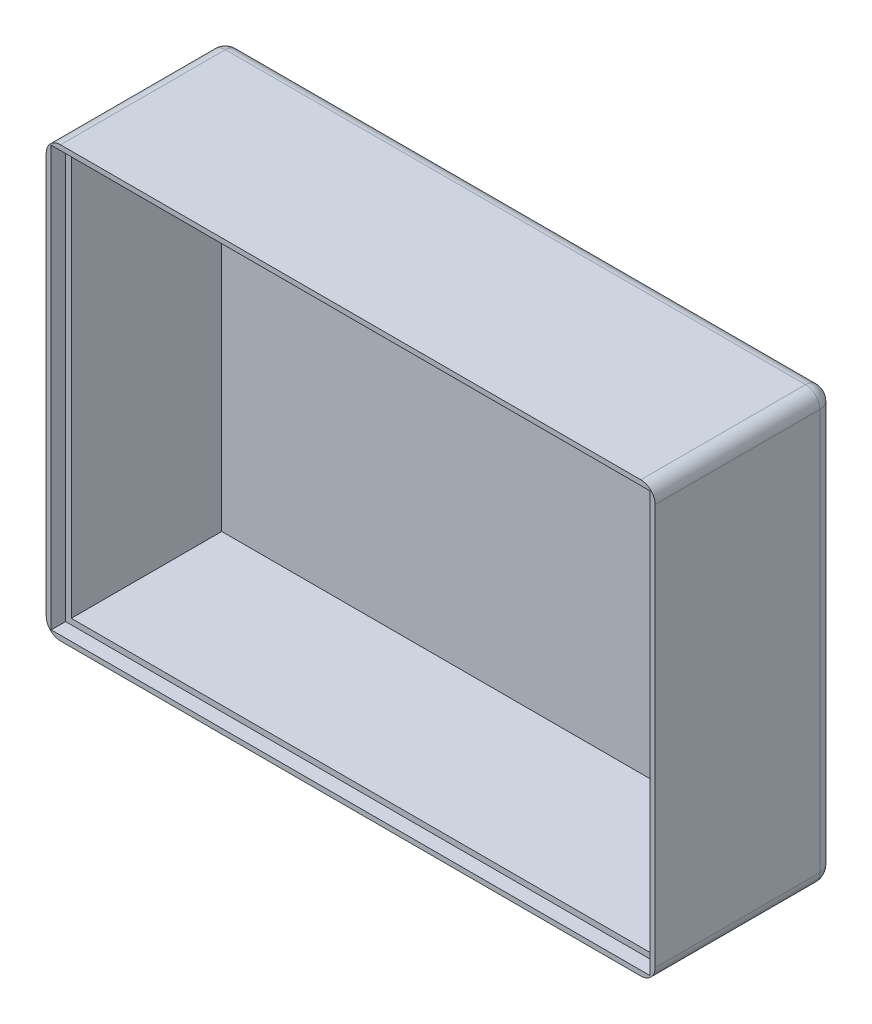
ISO-10303-21;
HEADER;
FILE_DESCRIPTION(('STEP AP214'),'2;1');
FILE_NAME('part.step','',(''),(''),'','','');
FILE_SCHEMA(('AUTOMOTIVE_DESIGN { 1 0 10303 214 1 1 1 1 }'));
ENDSEC;
DATA;
#1=APPLICATION_CONTEXT('core data for automotive mechanical design processes');
#2=APPLICATION_PROTOCOL_DEFINITION('international standard','automotive_design',2000,#1);
#3=PRODUCT_CONTEXT('',#1,'mechanical');
#4=PRODUCT('Part','Part','',(#3));
#5=PRODUCT_RELATED_PRODUCT_CATEGORY('part','',(#4));
#6=PRODUCT_DEFINITION_FORMATION('','',#4);
#7=PRODUCT_DEFINITION_CONTEXT('part definition',#1,'design');
#8=PRODUCT_DEFINITION('design','',#6,#7);
#9=PRODUCT_DEFINITION_SHAPE('','',#8);
#10=(LENGTH_UNIT() NAMED_UNIT(*) SI_UNIT(.MILLI.,.METRE.));
#11=(NAMED_UNIT(*) PLANE_ANGLE_UNIT() SI_UNIT($,.RADIAN.));
#12=(NAMED_UNIT(*) SI_UNIT($,.STERADIAN.) SOLID_ANGLE_UNIT());
#13=UNCERTAINTY_MEASURE_WITH_UNIT(LENGTH_MEASURE(1.E-05),#10,'distance_accuracy_value','');
#14=(GEOMETRIC_REPRESENTATION_CONTEXT(3) GLOBAL_UNCERTAINTY_ASSIGNED_CONTEXT((#13)) GLOBAL_UNIT_ASSIGNED_CONTEXT((#10,
#11,#12)) REPRESENTATION_CONTEXT('',''));
#15=CARTESIAN_POINT('',(0.,0.,0.));
#16=DIRECTION('',(0.,0.,1.));
#17=DIRECTION('',(1.,0.,0.));
#18=AXIS2_PLACEMENT_3D('',#15,#16,#17);
#19=CARTESIAN_POINT('',(0.,0.,25.));
#20=DIRECTION('',(0.,1.,0.));
#21=DIRECTION('',(0.,0.,1.));
#22=AXIS2_PLACEMENT_3D('',#19,#20,#21);
#23=PLANE('',#22);
#24=DIRECTION('',(1.,0.,0.));
#25=VECTOR('',#24,1.);
#26=CARTESIAN_POINT('',(0.,0.,2.));
#27=LINE('',#26,#25);
#28=CARTESIAN_POINT('',(83.,0.,2.));
#29=VERTEX_POINT('',#28);
#30=CARTESIAN_POINT('',(2.,0.,2.));
#31=VERTEX_POINT('',#30);
#32=EDGE_CURVE('E54',#29,#31,#27,.F.);
#33=ORIENTED_EDGE('',*,*,#32,.T.);
#34=DIRECTION('',(0.,0.,-1.));
#35=VECTOR('',#34,1.);
#36=CARTESIAN_POINT('',(2.,0.,25.));
#37=LINE('',#36,#35);
#38=CARTESIAN_POINT('',(2.,0.,25.));
#39=VERTEX_POINT('',#38);
#40=EDGE_CURVE('E11',#31,#39,#37,.F.);
#41=ORIENTED_EDGE('',*,*,#40,.T.);
#42=DIRECTION('',(1.,0.,0.));
#43=VECTOR('',#42,1.);
#44=CARTESIAN_POINT('',(0.,0.,25.));
#45=LINE('',#44,#43);
#46=CARTESIAN_POINT('',(83.,0.,25.));
#47=VERTEX_POINT('',#46);
#48=EDGE_CURVE('E254',#39,#47,#45,.T.);
#49=ORIENTED_EDGE('',*,*,#48,.T.);
#50=DIRECTION('',(0.,0.,-1.));
#51=VECTOR('',#50,1.);
#52=CARTESIAN_POINT('',(83.,0.,25.));
#53=LINE('',#52,#51);
#54=EDGE_CURVE('E68',#47,#29,#53,.T.);
#55=ORIENTED_EDGE('',*,*,#54,.T.);
#56=EDGE_LOOP('',(#33,#41,#49,#55));
#57=FACE_BOUND('',#56,.T.);
#58=ADVANCED_FACE('F44',(#57),#23,.T.);
#59=CARTESIAN_POINT('',(0.,0.,25.));
#60=DIRECTION('',(1.,0.,0.));
#61=DIRECTION('',(0.,1.,0.));
#62=AXIS2_PLACEMENT_3D('',#59,#60,#61);
#63=PLANE('',#62);
#64=DIRECTION('',(0.,-1.,0.));
#65=VECTOR('',#64,1.);
#66=CARTESIAN_POINT('',(0.,-60.,2.));
#67=LINE('',#66,#65);
#68=CARTESIAN_POINT('',(0.,-2.,2.));
#69=VERTEX_POINT('',#68);
#70=CARTESIAN_POINT('',(0.,-58.,2.));
#71=VERTEX_POINT('',#70);
#72=EDGE_CURVE('E332',#69,#71,#67,.T.);
#73=ORIENTED_EDGE('',*,*,#72,.T.);
#74=DIRECTION('',(0.,0.,-1.));
#75=VECTOR('',#74,1.);
#76=CARTESIAN_POINT('',(0.,-58.,25.));
#77=LINE('',#76,#75);
#78=CARTESIAN_POINT('',(0.,-58.,25.));
#79=VERTEX_POINT('',#78);
#80=EDGE_CURVE('E331',#71,#79,#77,.F.);
#81=ORIENTED_EDGE('',*,*,#80,.T.);
#82=DIRECTION('',(0.,-1.,0.));
#83=VECTOR('',#82,1.);
#84=CARTESIAN_POINT('',(0.,0.,25.));
#85=LINE('',#84,#83);
#86=CARTESIAN_POINT('',(0.,-2.,25.));
#87=VERTEX_POINT('',#86);
#88=EDGE_CURVE('E280',#87,#79,#85,.T.);
#89=ORIENTED_EDGE('',*,*,#88,.F.);
#90=DIRECTION('',(0.,0.,-1.));
#91=VECTOR('',#90,1.);
#92=CARTESIAN_POINT('',(0.,-2.,0.));
#93=LINE('',#92,#91);
#94=EDGE_CURVE('E327',#87,#69,#93,.T.);
#95=ORIENTED_EDGE('',*,*,#94,.T.);
#96=EDGE_LOOP('',(#73,#81,#89,#95));
#97=FACE_BOUND('',#96,.T.);
#98=ADVANCED_FACE('F399',(#97),#63,.F.);
#99=CARTESIAN_POINT('',(0.,-60.,25.));
#100=DIRECTION('',(0.,1.,0.));
#101=DIRECTION('',(0.,0.,1.));
#102=AXIS2_PLACEMENT_3D('',#99,#100,#101);
#103=PLANE('',#102);
#104=DIRECTION('',(1.,0.,0.));
#105=VECTOR('',#104,1.);
#106=CARTESIAN_POINT('',(85.,-60.,2.));
#107=LINE('',#106,#105);
#108=CARTESIAN_POINT('',(2.00000000000001,-60.,2.));
#109=VERTEX_POINT('',#108);
#110=CARTESIAN_POINT('',(83.,-60.,2.));
#111=VERTEX_POINT('',#110);
#112=EDGE_CURVE('E289',#109,#111,#107,.T.);
#113=ORIENTED_EDGE('',*,*,#112,.T.);
#114=DIRECTION('',(0.,0.,-1.));
#115=VECTOR('',#114,1.);
#116=CARTESIAN_POINT('',(83.,-60.,25.));
#117=LINE('',#116,#115);
#118=CARTESIAN_POINT('',(83.,-60.,25.));
#119=VERTEX_POINT('',#118);
#120=EDGE_CURVE('E292',#111,#119,#117,.F.);
#121=ORIENTED_EDGE('',*,*,#120,.T.);
#122=DIRECTION('',(1.,0.,0.));
#123=VECTOR('',#122,1.);
#124=CARTESIAN_POINT('',(0.,-60.,25.));
#125=LINE('',#124,#123);
#126=CARTESIAN_POINT('',(2.00000000000001,-60.,25.));
#127=VERTEX_POINT('',#126);
#128=EDGE_CURVE('E272',#127,#119,#125,.T.);
#129=ORIENTED_EDGE('',*,*,#128,.F.);
#130=DIRECTION('',(0.,0.,-1.));
#131=VECTOR('',#130,1.);
#132=CARTESIAN_POINT('',(2.00000000000001,-60.,25.));
#133=LINE('',#132,#131);
#134=EDGE_CURVE('E282',#127,#109,#133,.T.);
#135=ORIENTED_EDGE('',*,*,#134,.T.);
#136=EDGE_LOOP('',(#113,#121,#129,#135));
#137=FACE_BOUND('',#136,.T.);
#138=ADVANCED_FACE('F413',(#137),#103,.F.);
#139=CARTESIAN_POINT('',(85.,0.,25.));
#140=DIRECTION('',(1.,0.,0.));
#141=DIRECTION('',(0.,1.,0.));
#142=AXIS2_PLACEMENT_3D('',#139,#140,#141);
#143=PLANE('',#142);
#144=DIRECTION('',(0.,-1.,0.));
#145=VECTOR('',#144,1.);
#146=CARTESIAN_POINT('',(85.,0.,25.));
#147=LINE('',#146,#145);
#148=CARTESIAN_POINT('',(85.,-2.,25.));
#149=VERTEX_POINT('',#148);
#150=CARTESIAN_POINT('',(85.,-58.,25.));
#151=VERTEX_POINT('',#150);
#152=EDGE_CURVE('E267',#149,#151,#147,.T.);
#153=ORIENTED_EDGE('',*,*,#152,.T.);
#154=DIRECTION('',(0.,0.,-1.));
#155=VECTOR('',#154,1.);
#156=CARTESIAN_POINT('',(85.,-58.,0.));
#157=LINE('',#156,#155);
#158=CARTESIAN_POINT('',(85.,-58.,2.));
#159=VERTEX_POINT('',#158);
#160=EDGE_CURVE('E311',#151,#159,#157,.T.);
#161=ORIENTED_EDGE('',*,*,#160,.T.);
#162=DIRECTION('',(0.,-1.,0.));
#163=VECTOR('',#162,1.);
#164=CARTESIAN_POINT('',(85.,0.,2.));
#165=LINE('',#164,#163);
#166=CARTESIAN_POINT('',(85.,-2.,2.));
#167=VERTEX_POINT('',#166);
#168=EDGE_CURVE('E307',#159,#167,#165,.F.);
#169=ORIENTED_EDGE('',*,*,#168,.T.);
#170=DIRECTION('',(0.,0.,-1.));
#171=VECTOR('',#170,1.);
#172=CARTESIAN_POINT('',(85.,-2.,25.));
#173=LINE('',#172,#171);
#174=EDGE_CURVE('E309',#167,#149,#173,.F.);
#175=ORIENTED_EDGE('',*,*,#174,.T.);
#176=EDGE_LOOP('',(#153,#161,#169,#175));
#177=FACE_BOUND('',#176,.T.);
#178=ADVANCED_FACE('F423',(#177),#143,.T.);
#179=CARTESIAN_POINT('',(0.,0.,25.));
#180=DIRECTION('',(0.,0.,-1.));
#181=DIRECTION('',(-1.,0.,0.));
#182=AXIS2_PLACEMENT_3D('',#179,#180,#181);
#183=PLANE('',#182);
#184=DIRECTION('',(1.,0.,0.));
#185=VECTOR('',#184,1.);
#186=CARTESIAN_POINT('',(0.700000000000007,-59.3,25.));
#187=LINE('',#186,#185);
#188=CARTESIAN_POINT('',(0.700000000000007,-59.3,25.));
#189=VERTEX_POINT('',#188);
#190=CARTESIAN_POINT('',(84.3,-59.3,25.));
#191=VERTEX_POINT('',#190);
#192=EDGE_CURVE('E211',#189,#191,#187,.T.);
#193=ORIENTED_EDGE('',*,*,#192,.F.);
#194=DIRECTION('',(0.,-1.,0.));
#195=VECTOR('',#194,1.);
#196=CARTESIAN_POINT('',(0.7,-0.7,25.));
#197=LINE('',#196,#195);
#198=CARTESIAN_POINT('',(0.7,-0.7,25.));
#199=VERTEX_POINT('',#198);
#200=EDGE_CURVE('E179',#199,#189,#197,.T.);
#201=ORIENTED_EDGE('',*,*,#200,.F.);
#202=DIRECTION('',(-1.,0.,0.));
#203=VECTOR('',#202,1.);
#204=CARTESIAN_POINT('',(0.7,-0.7,25.));
#205=LINE('',#204,#203);
#206=CARTESIAN_POINT('',(84.3,-0.7,25.));
#207=VERTEX_POINT('',#206);
#208=EDGE_CURVE('E196',#207,#199,#205,.T.);
#209=ORIENTED_EDGE('',*,*,#208,.F.);
#210=DIRECTION('',(0.,1.,0.));
#211=VECTOR('',#210,1.);
#212=CARTESIAN_POINT('',(84.3,-0.7,25.));
#213=LINE('',#212,#211);
#214=EDGE_CURVE('E205',#191,#207,#213,.T.);
#215=ORIENTED_EDGE('',*,*,#214,.F.);
#216=EDGE_LOOP('',(#193,#201,#209,#215));
#217=FACE_BOUND('',#216,.T.);
#218=ORIENTED_EDGE('',*,*,#128,.T.);
#219=CARTESIAN_POINT('',(83.,-58.,25.));
#220=DIRECTION('',(0.,0.,-1.));
#221=DIRECTION('',(-1.,0.,0.));
#222=AXIS2_PLACEMENT_3D('',#219,#220,#221);
#223=CIRCLE('',#222,2.);
#224=EDGE_CURVE('E324',#119,#151,#223,.F.);
#225=ORIENTED_EDGE('',*,*,#224,.T.);
#226=ORIENTED_EDGE('',*,*,#152,.F.);
#227=CARTESIAN_POINT('',(83.,-2.,25.));
#228=DIRECTION('',(0.,0.,-1.));
#229=DIRECTION('',(-1.,0.,0.));
#230=AXIS2_PLACEMENT_3D('',#227,#228,#229);
#231=CIRCLE('',#230,2.);
#232=EDGE_CURVE('E316',#149,#47,#231,.F.);
#233=ORIENTED_EDGE('',*,*,#232,.T.);
#234=ORIENTED_EDGE('',*,*,#48,.F.);
#235=CARTESIAN_POINT('',(2.,-2.,25.));
#236=DIRECTION('',(0.,0.,-1.));
#237=DIRECTION('',(-1.,0.,0.));
#238=AXIS2_PLACEMENT_3D('',#235,#236,#237);
#239=CIRCLE('',#238,2.);
#240=EDGE_CURVE('E317',#39,#87,#239,.F.);
#241=ORIENTED_EDGE('',*,*,#240,.T.);
#242=ORIENTED_EDGE('',*,*,#88,.T.);
#243=CARTESIAN_POINT('',(2.00000000000001,-58.,25.));
#244=DIRECTION('',(0.,0.,-1.));
#245=DIRECTION('',(-1.,0.,0.));
#246=AXIS2_PLACEMENT_3D('',#243,#244,#245);
#247=CIRCLE('',#246,2.);
#248=EDGE_CURVE('E325',#79,#127,#247,.F.);
#249=ORIENTED_EDGE('',*,*,#248,.T.);
#250=EDGE_LOOP('',(#218,#225,#226,#233,#234,#241,#242,#249));
#251=FACE_BOUND('',#250,.T.);
#252=ADVANCED_FACE('F406',(#217,#251),#183,.F.);
#253=CARTESIAN_POINT('',(0.,0.,0.));
#254=DIRECTION('',(0.,0.,-1.));
#255=DIRECTION('',(-1.,0.,0.));
#256=AXIS2_PLACEMENT_3D('',#253,#254,#255);
#257=PLANE('',#256);
#258=DIRECTION('',(0.,-1.,0.));
#259=VECTOR('',#258,1.);
#260=CARTESIAN_POINT('',(83.,0.,0.));
#261=LINE('',#260,#259);
#262=CARTESIAN_POINT('',(83.,-2.,0.));
#263=VERTEX_POINT('',#262);
#264=CARTESIAN_POINT('',(83.,-58.,0.));
#265=VERTEX_POINT('',#264);
#266=EDGE_CURVE('E294',#263,#265,#261,.T.);
#267=ORIENTED_EDGE('',*,*,#266,.T.);
#268=DIRECTION('',(1.,0.,0.));
#269=VECTOR('',#268,1.);
#270=CARTESIAN_POINT('',(0.,-58.,0.));
#271=LINE('',#270,#269);
#272=CARTESIAN_POINT('',(2.00000000000001,-58.,0.));
#273=VERTEX_POINT('',#272);
#274=EDGE_CURVE('E302',#265,#273,#271,.F.);
#275=ORIENTED_EDGE('',*,*,#274,.T.);
#276=DIRECTION('',(0.,-1.,0.));
#277=VECTOR('',#276,1.);
#278=CARTESIAN_POINT('',(2.,0.,0.));
#279=LINE('',#278,#277);
#280=CARTESIAN_POINT('',(2.,-2.,0.));
#281=VERTEX_POINT('',#280);
#282=EDGE_CURVE('E299',#273,#281,#279,.F.);
#283=ORIENTED_EDGE('',*,*,#282,.T.);
#284=DIRECTION('',(1.,0.,0.));
#285=VECTOR('',#284,1.);
#286=CARTESIAN_POINT('',(0.,-2.,0.));
#287=LINE('',#286,#285);
#288=EDGE_CURVE('E300',#281,#263,#287,.T.);
#289=ORIENTED_EDGE('',*,*,#288,.T.);
#290=EDGE_LOOP('',(#267,#275,#283,#289));
#291=FACE_BOUND('',#290,.T.);
#292=ADVANCED_FACE('F440',(#291),#257,.T.);
#293=CARTESIAN_POINT('',(0.,0.,23.));
#294=DIRECTION('',(0.,0.,1.));
#295=DIRECTION('',(1.,0.,0.));
#296=AXIS2_PLACEMENT_3D('',#293,#294,#295);
#297=PLANE('',#296);
#298=DIRECTION('',(0.,-1.,0.));
#299=VECTOR('',#298,1.);
#300=CARTESIAN_POINT('',(0.7,-0.7,23.));
#301=LINE('',#300,#299);
#302=CARTESIAN_POINT('',(0.7,-0.7,23.));
#303=VERTEX_POINT('',#302);
#304=CARTESIAN_POINT('',(0.700000000000007,-59.3,23.));
#305=VERTEX_POINT('',#304);
#306=EDGE_CURVE('E172',#303,#305,#301,.T.);
#307=ORIENTED_EDGE('',*,*,#306,.T.);
#308=DIRECTION('',(1.,0.,0.));
#309=VECTOR('',#308,1.);
#310=CARTESIAN_POINT('',(0.700000000000007,-59.3,23.));
#311=LINE('',#310,#309);
#312=CARTESIAN_POINT('',(84.3,-59.3,23.));
#313=VERTEX_POINT('',#312);
#314=EDGE_CURVE('E188',#305,#313,#311,.T.);
#315=ORIENTED_EDGE('',*,*,#314,.T.);
#316=DIRECTION('',(0.,1.,0.));
#317=VECTOR('',#316,1.);
#318=CARTESIAN_POINT('',(84.3,-0.7,23.));
#319=LINE('',#318,#317);
#320=CARTESIAN_POINT('',(84.3,-0.7,23.));
#321=VERTEX_POINT('',#320);
#322=EDGE_CURVE('E194',#313,#321,#319,.T.);
#323=ORIENTED_EDGE('',*,*,#322,.T.);
#324=DIRECTION('',(-1.,0.,0.));
#325=VECTOR('',#324,1.);
#326=CARTESIAN_POINT('',(0.7,-0.7,23.));
#327=LINE('',#326,#325);
#328=EDGE_CURVE('E181',#321,#303,#327,.T.);
#329=ORIENTED_EDGE('',*,*,#328,.T.);
#330=EDGE_LOOP('',(#307,#315,#323,#329));
#331=FACE_BOUND('',#330,.T.);
#332=DIRECTION('',(0.,1.,0.));
#333=VECTOR('',#332,1.);
#334=CARTESIAN_POINT('',(1.5,-1.5,23.));
#335=LINE('',#334,#333);
#336=CARTESIAN_POINT('',(1.50000000000001,-58.5,23.));
#337=VERTEX_POINT('',#336);
#338=CARTESIAN_POINT('',(1.5,-1.5,23.));
#339=VERTEX_POINT('',#338);
#340=EDGE_CURVE('E233',#337,#339,#335,.T.);
#341=ORIENTED_EDGE('',*,*,#340,.T.);
#342=DIRECTION('',(1.,0.,0.));
#343=VECTOR('',#342,1.);
#344=CARTESIAN_POINT('',(1.5,-1.5,23.));
#345=LINE('',#344,#343);
#346=CARTESIAN_POINT('',(83.5,-1.5,23.));
#347=VERTEX_POINT('',#346);
#348=EDGE_CURVE('E226',#339,#347,#345,.T.);
#349=ORIENTED_EDGE('',*,*,#348,.T.);
#350=DIRECTION('',(0.,-1.,0.));
#351=VECTOR('',#350,1.);
#352=CARTESIAN_POINT('',(83.5,-1.5,23.));
#353=LINE('',#352,#351);
#354=CARTESIAN_POINT('',(83.5,-58.5,23.));
#355=VERTEX_POINT('',#354);
#356=EDGE_CURVE('E219',#347,#355,#353,.T.);
#357=ORIENTED_EDGE('',*,*,#356,.T.);
#358=DIRECTION('',(-1.,0.,0.));
#359=VECTOR('',#358,1.);
#360=CARTESIAN_POINT('',(1.50000000000001,-58.5,23.));
#361=LINE('',#360,#359);
#362=EDGE_CURVE('E283',#355,#337,#361,.T.);
#363=ORIENTED_EDGE('',*,*,#362,.T.);
#364=EDGE_LOOP('',(#341,#349,#357,#363));
#365=FACE_BOUND('',#364,.T.);
#366=ADVANCED_FACE('F195',(#331,#365),#297,.T.);
#367=CARTESIAN_POINT('',(0.7,-0.7,23.));
#368=DIRECTION('',(-1.,0.,0.));
#369=DIRECTION('',(0.,-1.,0.));
#370=AXIS2_PLACEMENT_3D('',#367,#368,#369);
#371=PLANE('',#370);
#372=ORIENTED_EDGE('',*,*,#200,.T.);
#373=DIRECTION('',(0.,0.,1.));
#374=VECTOR('',#373,1.);
#375=CARTESIAN_POINT('',(0.700000000000007,-59.3,23.));
#376=LINE('',#375,#374);
#377=EDGE_CURVE('E168',#305,#189,#376,.T.);
#378=ORIENTED_EDGE('',*,*,#377,.F.);
#379=ORIENTED_EDGE('',*,*,#306,.F.);
#380=DIRECTION('',(0.,0.,1.));
#381=VECTOR('',#380,1.);
#382=CARTESIAN_POINT('',(0.7,-0.7,23.));
#383=LINE('',#382,#381);
#384=EDGE_CURVE('E220',#303,#199,#383,.T.);
#385=ORIENTED_EDGE('',*,*,#384,.T.);
#386=EDGE_LOOP('',(#372,#378,#379,#385));
#387=FACE_BOUND('',#386,.T.);
#388=ADVANCED_FACE('F175',(#387),#371,.F.);
#389=CARTESIAN_POINT('',(0.7,-0.7,23.));
#390=DIRECTION('',(0.,1.,0.));
#391=DIRECTION('',(0.,0.,1.));
#392=AXIS2_PLACEMENT_3D('',#389,#390,#391);
#393=PLANE('',#392);
#394=ORIENTED_EDGE('',*,*,#208,.T.);
#395=ORIENTED_EDGE('',*,*,#384,.F.);
#396=ORIENTED_EDGE('',*,*,#328,.F.);
#397=DIRECTION('',(0.,0.,1.));
#398=VECTOR('',#397,1.);
#399=CARTESIAN_POINT('',(84.3,-0.7,23.));
#400=LINE('',#399,#398);
#401=EDGE_CURVE('E222',#321,#207,#400,.T.);
#402=ORIENTED_EDGE('',*,*,#401,.T.);
#403=EDGE_LOOP('',(#394,#395,#396,#402));
#404=FACE_BOUND('',#403,.T.);
#405=ADVANCED_FACE('F564',(#404),#393,.F.);
#406=CARTESIAN_POINT('',(84.3,-0.7,23.));
#407=DIRECTION('',(1.,0.,0.));
#408=DIRECTION('',(0.,1.,0.));
#409=AXIS2_PLACEMENT_3D('',#406,#407,#408);
#410=PLANE('',#409);
#411=ORIENTED_EDGE('',*,*,#214,.T.);
#412=ORIENTED_EDGE('',*,*,#401,.F.);
#413=ORIENTED_EDGE('',*,*,#322,.F.);
#414=DIRECTION('',(0.,0.,1.));
#415=VECTOR('',#414,1.);
#416=CARTESIAN_POINT('',(84.3,-59.3,23.));
#417=LINE('',#416,#415);
#418=EDGE_CURVE('E185',#313,#191,#417,.T.);
#419=ORIENTED_EDGE('',*,*,#418,.T.);
#420=EDGE_LOOP('',(#411,#412,#413,#419));
#421=FACE_BOUND('',#420,.T.);
#422=ADVANCED_FACE('F551',(#421),#410,.F.);
#423=CARTESIAN_POINT('',(0.700000000000007,-59.3,23.));
#424=DIRECTION('',(0.,-1.,0.));
#425=DIRECTION('',(0.,0.,-1.));
#426=AXIS2_PLACEMENT_3D('',#423,#424,#425);
#427=PLANE('',#426);
#428=ORIENTED_EDGE('',*,*,#192,.T.);
#429=ORIENTED_EDGE('',*,*,#418,.F.);
#430=ORIENTED_EDGE('',*,*,#314,.F.);
#431=ORIENTED_EDGE('',*,*,#377,.T.);
#432=EDGE_LOOP('',(#428,#429,#430,#431));
#433=FACE_BOUND('',#432,.T.);
#434=ADVANCED_FACE('F190',(#433),#427,.F.);
#435=CARTESIAN_POINT('',(0.,0.,2.));
#436=DIRECTION('',(0.,0.,1.));
#437=DIRECTION('',(1.,0.,0.));
#438=AXIS2_PLACEMENT_3D('',#435,#436,#437);
#439=PLANE('',#438);
#440=DIRECTION('',(0.,-1.,0.));
#441=VECTOR('',#440,1.);
#442=CARTESIAN_POINT('',(1.5,-1.5,2.));
#443=LINE('',#442,#441);
#444=CARTESIAN_POINT('',(1.5,-1.5,2.));
#445=VERTEX_POINT('',#444);
#446=CARTESIAN_POINT('',(1.50000000000001,-58.5,2.));
#447=VERTEX_POINT('',#446);
#448=EDGE_CURVE('E235',#445,#447,#443,.T.);
#449=ORIENTED_EDGE('',*,*,#448,.T.);
#450=DIRECTION('',(1.,0.,0.));
#451=VECTOR('',#450,1.);
#452=CARTESIAN_POINT('',(1.50000000000001,-58.5,2.));
#453=LINE('',#452,#451);
#454=CARTESIAN_POINT('',(83.5,-58.5,2.));
#455=VERTEX_POINT('',#454);
#456=EDGE_CURVE('E236',#447,#455,#453,.T.);
#457=ORIENTED_EDGE('',*,*,#456,.T.);
#458=DIRECTION('',(0.,1.,0.));
#459=VECTOR('',#458,1.);
#460=CARTESIAN_POINT('',(83.5,-1.5,2.));
#461=LINE('',#460,#459);
#462=CARTESIAN_POINT('',(83.5,-1.5,2.));
#463=VERTEX_POINT('',#462);
#464=EDGE_CURVE('E245',#455,#463,#461,.T.);
#465=ORIENTED_EDGE('',*,*,#464,.T.);
#466=DIRECTION('',(-1.,0.,0.));
#467=VECTOR('',#466,1.);
#468=CARTESIAN_POINT('',(1.5,-1.5,2.));
#469=LINE('',#468,#467);
#470=EDGE_CURVE('E248',#463,#445,#469,.T.);
#471=ORIENTED_EDGE('',*,*,#470,.T.);
#472=EDGE_LOOP('',(#449,#457,#465,#471));
#473=FACE_BOUND('',#472,.T.);
#474=ADVANCED_FACE('F554',(#473),#439,.T.);
#475=CARTESIAN_POINT('',(1.50000000000001,-58.5,2.));
#476=DIRECTION('',(0.,-1.,0.));
#477=DIRECTION('',(0.,0.,-1.));
#478=AXIS2_PLACEMENT_3D('',#475,#476,#477);
#479=PLANE('',#478);
#480=ORIENTED_EDGE('',*,*,#362,.F.);
#481=DIRECTION('',(0.,0.,1.));
#482=VECTOR('',#481,1.);
#483=CARTESIAN_POINT('',(83.5,-58.5,2.));
#484=LINE('',#483,#482);
#485=EDGE_CURVE('E257',#455,#355,#484,.T.);
#486=ORIENTED_EDGE('',*,*,#485,.F.);
#487=ORIENTED_EDGE('',*,*,#456,.F.);
#488=DIRECTION('',(0.,0.,1.));
#489=VECTOR('',#488,1.);
#490=CARTESIAN_POINT('',(1.50000000000001,-58.5,2.));
#491=LINE('',#490,#489);
#492=EDGE_CURVE('E246',#447,#337,#491,.T.);
#493=ORIENTED_EDGE('',*,*,#492,.T.);
#494=EDGE_LOOP('',(#480,#486,#487,#493));
#495=FACE_BOUND('',#494,.T.);
#496=ADVANCED_FACE('F615',(#495),#479,.F.);
#497=CARTESIAN_POINT('',(83.5,-1.5,2.));
#498=DIRECTION('',(1.,0.,0.));
#499=DIRECTION('',(0.,1.,0.));
#500=AXIS2_PLACEMENT_3D('',#497,#498,#499);
#501=PLANE('',#500);
#502=ORIENTED_EDGE('',*,*,#356,.F.);
#503=DIRECTION('',(0.,0.,1.));
#504=VECTOR('',#503,1.);
#505=CARTESIAN_POINT('',(83.5,-1.5,2.));
#506=LINE('',#505,#504);
#507=EDGE_CURVE('E258',#463,#347,#506,.T.);
#508=ORIENTED_EDGE('',*,*,#507,.F.);
#509=ORIENTED_EDGE('',*,*,#464,.F.);
#510=ORIENTED_EDGE('',*,*,#485,.T.);
#511=EDGE_LOOP('',(#502,#508,#509,#510));
#512=FACE_BOUND('',#511,.T.);
#513=ADVANCED_FACE('F605',(#512),#501,.F.);
#514=CARTESIAN_POINT('',(1.5,-1.5,2.));
#515=DIRECTION('',(0.,1.,0.));
#516=DIRECTION('',(0.,0.,1.));
#517=AXIS2_PLACEMENT_3D('',#514,#515,#516);
#518=PLANE('',#517);
#519=ORIENTED_EDGE('',*,*,#348,.F.);
#520=DIRECTION('',(0.,0.,1.));
#521=VECTOR('',#520,1.);
#522=CARTESIAN_POINT('',(1.5,-1.5,2.));
#523=LINE('',#522,#521);
#524=EDGE_CURVE('E253',#445,#339,#523,.T.);
#525=ORIENTED_EDGE('',*,*,#524,.F.);
#526=ORIENTED_EDGE('',*,*,#470,.F.);
#527=ORIENTED_EDGE('',*,*,#507,.T.);
#528=EDGE_LOOP('',(#519,#525,#526,#527));
#529=FACE_BOUND('',#528,.T.);
#530=ADVANCED_FACE('F595',(#529),#518,.F.);
#531=CARTESIAN_POINT('',(1.5,-1.5,2.));
#532=DIRECTION('',(-1.,0.,0.));
#533=DIRECTION('',(0.,-1.,0.));
#534=AXIS2_PLACEMENT_3D('',#531,#532,#533);
#535=PLANE('',#534);
#536=ORIENTED_EDGE('',*,*,#340,.F.);
#537=ORIENTED_EDGE('',*,*,#492,.F.);
#538=ORIENTED_EDGE('',*,*,#448,.F.);
#539=ORIENTED_EDGE('',*,*,#524,.T.);
#540=EDGE_LOOP('',(#536,#537,#538,#539));
#541=FACE_BOUND('',#540,.T.);
#542=ADVANCED_FACE('F544',(#541),#535,.F.);
#543=CARTESIAN_POINT('',(2.,-2.,25.));
#544=DIRECTION('',(0.,0.,1.));
#545=DIRECTION('',(1.,0.,0.));
#546=AXIS2_PLACEMENT_3D('',#543,#544,#545);
#547=CYLINDRICAL_SURFACE('',#546,2.);
#548=ORIENTED_EDGE('',*,*,#240,.F.);
#549=ORIENTED_EDGE('',*,*,#40,.F.);
#550=CARTESIAN_POINT('',(2.,-2.,2.));
#551=DIRECTION('',(0.,0.,-1.));
#552=DIRECTION('',(0.,1.,0.));
#553=AXIS2_PLACEMENT_3D('',#550,#551,#552);
#554=CIRCLE('',#553,2.);
#555=EDGE_CURVE('E378',#69,#31,#554,.T.);
#556=ORIENTED_EDGE('',*,*,#555,.F.);
#557=ORIENTED_EDGE('',*,*,#94,.F.);
#558=EDGE_LOOP('',(#548,#549,#556,#557));
#559=FACE_BOUND('',#558,.T.);
#560=ADVANCED_FACE('F50',(#559),#547,.T.);
#561=CARTESIAN_POINT('',(83.,-2.,25.));
#562=DIRECTION('',(0.,0.,-1.));
#563=DIRECTION('',(-1.,0.,0.));
#564=AXIS2_PLACEMENT_3D('',#561,#562,#563);
#565=CYLINDRICAL_SURFACE('',#564,2.);
#566=ORIENTED_EDGE('',*,*,#232,.F.);
#567=ORIENTED_EDGE('',*,*,#174,.F.);
#568=CARTESIAN_POINT('',(83.,-2.,2.));
#569=DIRECTION('',(0.,0.,-1.));
#570=DIRECTION('',(-1.,0.,0.));
#571=AXIS2_PLACEMENT_3D('',#568,#569,#570);
#572=CIRCLE('',#571,2.);
#573=EDGE_CURVE('E374',#29,#167,#572,.T.);
#574=ORIENTED_EDGE('',*,*,#573,.F.);
#575=ORIENTED_EDGE('',*,*,#54,.F.);
#576=EDGE_LOOP('',(#566,#567,#574,#575));
#577=FACE_BOUND('',#576,.T.);
#578=ADVANCED_FACE('F426',(#577),#565,.T.);
#579=CARTESIAN_POINT('',(0.,-2.,2.));
#580=DIRECTION('',(1.,0.,0.));
#581=DIRECTION('',(0.,0.,-1.));
#582=AXIS2_PLACEMENT_3D('',#579,#580,#581);
#583=CYLINDRICAL_SURFACE('',#582,2.);
#584=CARTESIAN_POINT('',(2.,-2.,2.));
#585=DIRECTION('',(-1.,0.,0.));
#586=DIRECTION('',(0.,0.,1.));
#587=AXIS2_PLACEMENT_3D('',#584,#585,#586);
#588=CIRCLE('',#587,2.);
#589=EDGE_CURVE('E47',#31,#281,#588,.T.);
#590=ORIENTED_EDGE('',*,*,#589,.F.);
#591=ORIENTED_EDGE('',*,*,#32,.F.);
#592=CARTESIAN_POINT('',(83.,-2.,2.));
#593=DIRECTION('',(1.,0.,0.));
#594=DIRECTION('',(0.,0.,-1.));
#595=AXIS2_PLACEMENT_3D('',#592,#593,#594);
#596=CIRCLE('',#595,2.);
#597=EDGE_CURVE('E371',#263,#29,#596,.T.);
#598=ORIENTED_EDGE('',*,*,#597,.F.);
#599=ORIENTED_EDGE('',*,*,#288,.F.);
#600=EDGE_LOOP('',(#590,#591,#598,#599));
#601=FACE_BOUND('',#600,.T.);
#602=ADVANCED_FACE('F437',(#601),#583,.T.);
#603=CARTESIAN_POINT('',(2.,-2.,2.));
#604=DIRECTION('',(0.,1.,0.));
#605=DIRECTION('',(0.,0.,1.));
#606=AXIS2_PLACEMENT_3D('',#603,#604,#605);
#607=SPHERICAL_SURFACE('',#606,2.);
#608=ORIENTED_EDGE('',*,*,#555,.T.);
#609=ORIENTED_EDGE('',*,*,#589,.T.);
#610=CARTESIAN_POINT('',(2.,-2.,2.));
#611=DIRECTION('',(0.,1.,0.));
#612=DIRECTION('',(-1.,0.,0.));
#613=AXIS2_PLACEMENT_3D('',#610,#611,#612);
#614=CIRCLE('',#613,2.);
#615=EDGE_CURVE('E370',#69,#281,#614,.F.);
#616=ORIENTED_EDGE('',*,*,#615,.F.);
#617=EDGE_LOOP('',(#608,#609,#616));
#618=FACE_BOUND('',#617,.T.);
#619=ADVANCED_FACE('F390',(#618),#607,.T.);
#620=CARTESIAN_POINT('',(83.,-2.,2.));
#621=DIRECTION('',(0.,1.,0.));
#622=DIRECTION('',(0.,0.,1.));
#623=AXIS2_PLACEMENT_3D('',#620,#621,#622);
#624=SPHERICAL_SURFACE('',#623,2.);
#625=ORIENTED_EDGE('',*,*,#597,.T.);
#626=ORIENTED_EDGE('',*,*,#573,.T.);
#627=CARTESIAN_POINT('',(83.,-2.,2.));
#628=DIRECTION('',(0.,1.,0.));
#629=DIRECTION('',(-1.,0.,0.));
#630=AXIS2_PLACEMENT_3D('',#627,#628,#629);
#631=CIRCLE('',#630,2.);
#632=EDGE_CURVE('E361',#263,#167,#631,.F.);
#633=ORIENTED_EDGE('',*,*,#632,.F.);
#634=EDGE_LOOP('',(#625,#626,#633));
#635=FACE_BOUND('',#634,.T.);
#636=ADVANCED_FACE('F427',(#635),#624,.T.);
#637=CARTESIAN_POINT('',(2.,0.,2.));
#638=DIRECTION('',(0.,1.,0.));
#639=DIRECTION('',(-1.,0.,0.));
#640=AXIS2_PLACEMENT_3D('',#637,#638,#639);
#641=CYLINDRICAL_SURFACE('',#640,2.);
#642=ORIENTED_EDGE('',*,*,#615,.T.);
#643=ORIENTED_EDGE('',*,*,#282,.F.);
#644=CARTESIAN_POINT('',(2.00000000000001,-58.,2.));
#645=DIRECTION('',(0.,-1.,0.));
#646=DIRECTION('',(0.,0.,-1.));
#647=AXIS2_PLACEMENT_3D('',#644,#645,#646);
#648=CIRCLE('',#647,2.);
#649=EDGE_CURVE('E360',#71,#273,#648,.T.);
#650=ORIENTED_EDGE('',*,*,#649,.F.);
#651=ORIENTED_EDGE('',*,*,#72,.F.);
#652=EDGE_LOOP('',(#642,#643,#650,#651));
#653=FACE_BOUND('',#652,.T.);
#654=ADVANCED_FACE('F391',(#653),#641,.T.);
#655=CARTESIAN_POINT('',(2.00000000000001,-58.,25.));
#656=DIRECTION('',(0.,0.,-1.));
#657=DIRECTION('',(-1.,0.,0.));
#658=AXIS2_PLACEMENT_3D('',#655,#656,#657);
#659=CYLINDRICAL_SURFACE('',#658,2.);
#660=ORIENTED_EDGE('',*,*,#248,.F.);
#661=ORIENTED_EDGE('',*,*,#80,.F.);
#662=CARTESIAN_POINT('',(2.00000000000001,-58.,2.));
#663=DIRECTION('',(0.,0.,-1.));
#664=DIRECTION('',(-1.,0.,0.));
#665=AXIS2_PLACEMENT_3D('',#662,#663,#664);
#666=CIRCLE('',#665,2.);
#667=EDGE_CURVE('E354',#109,#71,#666,.T.);
#668=ORIENTED_EDGE('',*,*,#667,.F.);
#669=ORIENTED_EDGE('',*,*,#134,.F.);
#670=EDGE_LOOP('',(#660,#661,#668,#669));
#671=FACE_BOUND('',#670,.T.);
#672=ADVANCED_FACE('F401',(#671),#659,.T.);
#673=CARTESIAN_POINT('',(83.,-58.,25.));
#674=DIRECTION('',(0.,0.,1.));
#675=DIRECTION('',(1.,0.,0.));
#676=AXIS2_PLACEMENT_3D('',#673,#674,#675);
#677=CYLINDRICAL_SURFACE('',#676,2.);
#678=ORIENTED_EDGE('',*,*,#224,.F.);
#679=ORIENTED_EDGE('',*,*,#120,.F.);
#680=CARTESIAN_POINT('',(83.,-58.,2.));
#681=DIRECTION('',(0.,0.,-1.));
#682=DIRECTION('',(0.,1.,0.));
#683=AXIS2_PLACEMENT_3D('',#680,#681,#682);
#684=CIRCLE('',#683,2.);
#685=EDGE_CURVE('E353',#159,#111,#684,.T.);
#686=ORIENTED_EDGE('',*,*,#685,.F.);
#687=ORIENTED_EDGE('',*,*,#160,.F.);
#688=EDGE_LOOP('',(#678,#679,#686,#687));
#689=FACE_BOUND('',#688,.T.);
#690=ADVANCED_FACE('F418',(#689),#677,.T.);
#691=CARTESIAN_POINT('',(83.,0.,2.));
#692=DIRECTION('',(0.,-1.,0.));
#693=DIRECTION('',(1.,0.,0.));
#694=AXIS2_PLACEMENT_3D('',#691,#692,#693);
#695=CYLINDRICAL_SURFACE('',#694,2.);
#696=ORIENTED_EDGE('',*,*,#632,.T.);
#697=ORIENTED_EDGE('',*,*,#168,.F.);
#698=CARTESIAN_POINT('',(83.,-58.,2.));
#699=DIRECTION('',(0.,-1.,0.));
#700=DIRECTION('',(0.,0.,-1.));
#701=AXIS2_PLACEMENT_3D('',#698,#699,#700);
#702=CIRCLE('',#701,2.);
#703=EDGE_CURVE('E350',#265,#159,#702,.T.);
#704=ORIENTED_EDGE('',*,*,#703,.F.);
#705=ORIENTED_EDGE('',*,*,#266,.F.);
#706=EDGE_LOOP('',(#696,#697,#704,#705));
#707=FACE_BOUND('',#706,.T.);
#708=ADVANCED_FACE('F433',(#707),#695,.T.);
#709=CARTESIAN_POINT('',(2.00000000000001,-58.,2.));
#710=DIRECTION('',(-1.,0.,0.));
#711=DIRECTION('',(0.,0.,1.));
#712=AXIS2_PLACEMENT_3D('',#709,#710,#711);
#713=SPHERICAL_SURFACE('',#712,2.);
#714=ORIENTED_EDGE('',*,*,#667,.T.);
#715=ORIENTED_EDGE('',*,*,#649,.T.);
#716=CARTESIAN_POINT('',(2.00000000000001,-58.,2.));
#717=DIRECTION('',(-1.,0.,0.));
#718=DIRECTION('',(0.,0.,1.));
#719=AXIS2_PLACEMENT_3D('',#716,#717,#718);
#720=CIRCLE('',#719,2.);
#721=EDGE_CURVE('E345',#109,#273,#720,.F.);
#722=ORIENTED_EDGE('',*,*,#721,.F.);
#723=EDGE_LOOP('',(#714,#715,#722));
#724=FACE_BOUND('',#723,.T.);
#725=ADVANCED_FACE('F461',(#724),#713,.T.);
#726=CARTESIAN_POINT('',(83.,-58.,2.));
#727=DIRECTION('',(1.,0.,0.));
#728=DIRECTION('',(0.,0.,-1.));
#729=AXIS2_PLACEMENT_3D('',#726,#727,#728);
#730=SPHERICAL_SURFACE('',#729,2.);
#731=ORIENTED_EDGE('',*,*,#703,.T.);
#732=ORIENTED_EDGE('',*,*,#685,.T.);
#733=CARTESIAN_POINT('',(83.,-58.,2.));
#734=DIRECTION('',(1.,0.,0.));
#735=DIRECTION('',(0.,0.,-1.));
#736=AXIS2_PLACEMENT_3D('',#733,#734,#735);
#737=CIRCLE('',#736,2.);
#738=EDGE_CURVE('E343',#265,#111,#737,.F.);
#739=ORIENTED_EDGE('',*,*,#738,.F.);
#740=EDGE_LOOP('',(#731,#732,#739));
#741=FACE_BOUND('',#740,.T.);
#742=ADVANCED_FACE('F459',(#741),#730,.T.);
#743=CARTESIAN_POINT('',(0.,-58.,2.));
#744=DIRECTION('',(-1.,0.,0.));
#745=DIRECTION('',(0.,0.,1.));
#746=AXIS2_PLACEMENT_3D('',#743,#744,#745);
#747=CYLINDRICAL_SURFACE('',#746,2.);
#748=ORIENTED_EDGE('',*,*,#721,.T.);
#749=ORIENTED_EDGE('',*,*,#274,.F.);
#750=ORIENTED_EDGE('',*,*,#738,.T.);
#751=ORIENTED_EDGE('',*,*,#112,.F.);
#752=EDGE_LOOP('',(#748,#749,#750,#751));
#753=FACE_BOUND('',#752,.T.);
#754=ADVANCED_FACE('F457',(#753),#747,.T.);
#755=CLOSED_SHELL('',(#58,#98,#138,#178,#252,#292,#366,#388,#405,#422,#434,#474,#496,#513,#530,
#542,#560,#578,#602,#619,#636,#654,#672,#690,#708,#725,#742,#754));
#756=MANIFOLD_SOLID_BREP('B2',#755);
#757=ADVANCED_BREP_SHAPE_REPRESENTATION('',(#18,#756),#14);
#758=SHAPE_DEFINITION_REPRESENTATION(#9,#757);
ENDSEC;
END-ISO-10303-21;
